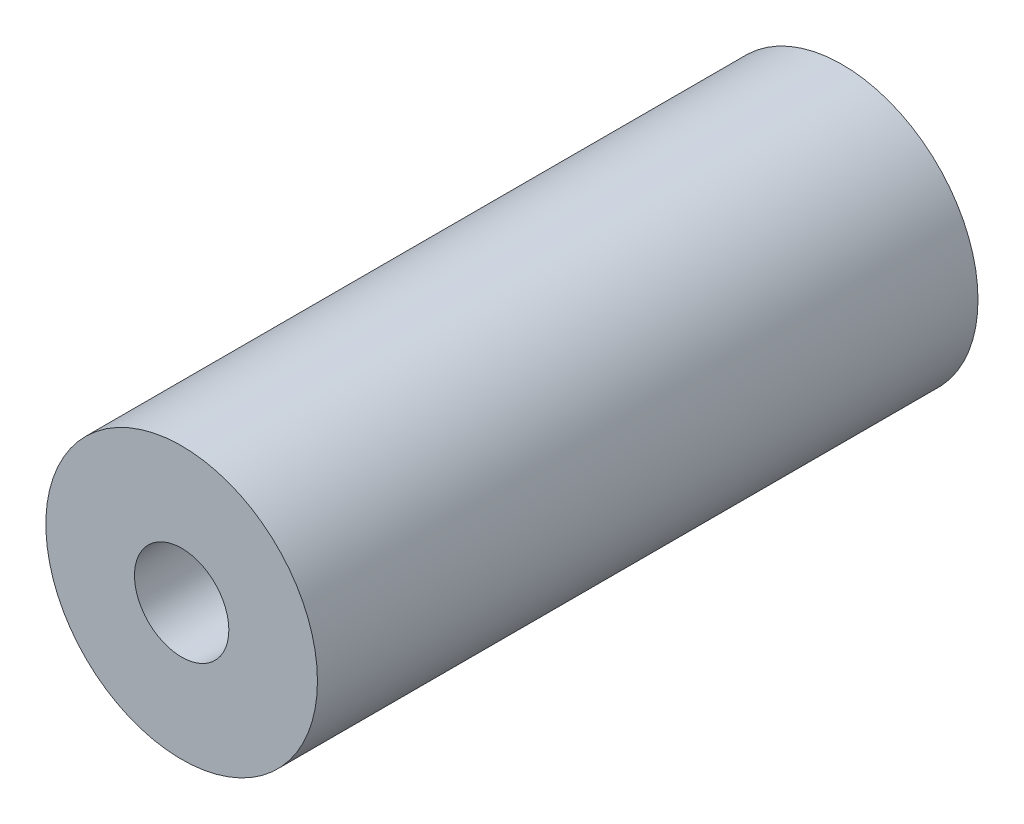
ISO-10303-21;
HEADER;
FILE_DESCRIPTION(('STEP AP214'),'2;1');
FILE_NAME('part.step','',(''),(''),'','','');
FILE_SCHEMA(('AUTOMOTIVE_DESIGN { 1 0 10303 214 1 1 1 1 }'));
ENDSEC;
DATA;
#1=APPLICATION_CONTEXT('core data for automotive mechanical design processes');
#2=APPLICATION_PROTOCOL_DEFINITION('international standard','automotive_design',2000,#1);
#3=PRODUCT_CONTEXT('',#1,'mechanical');
#4=PRODUCT('Part','Part','',(#3));
#5=PRODUCT_RELATED_PRODUCT_CATEGORY('part','',(#4));
#6=PRODUCT_DEFINITION_FORMATION('','',#4);
#7=PRODUCT_DEFINITION_CONTEXT('part definition',#1,'design');
#8=PRODUCT_DEFINITION('design','',#6,#7);
#9=PRODUCT_DEFINITION_SHAPE('','',#8);
#10=(LENGTH_UNIT() NAMED_UNIT(*) SI_UNIT(.MILLI.,.METRE.));
#11=(NAMED_UNIT(*) PLANE_ANGLE_UNIT() SI_UNIT($,.RADIAN.));
#12=(NAMED_UNIT(*) SI_UNIT($,.STERADIAN.) SOLID_ANGLE_UNIT());
#13=UNCERTAINTY_MEASURE_WITH_UNIT(LENGTH_MEASURE(1.E-05),#10,'distance_accuracy_value','');
#14=(GEOMETRIC_REPRESENTATION_CONTEXT(3) GLOBAL_UNCERTAINTY_ASSIGNED_CONTEXT((#13)) GLOBAL_UNIT_ASSIGNED_CONTEXT((#10,
#11,#12)) REPRESENTATION_CONTEXT('',''));
#15=CARTESIAN_POINT('',(0.,0.,0.));
#16=DIRECTION('',(0.,0.,1.));
#17=DIRECTION('',(1.,0.,0.));
#18=AXIS2_PLACEMENT_3D('',#15,#16,#17);
#19=CARTESIAN_POINT('',(0.,0.,-66.4234682221834));
#20=DIRECTION('',(0.,0.,1.));
#21=DIRECTION('',(1.,0.,0.));
#22=AXIS2_PLACEMENT_3D('',#19,#20,#21);
#23=CYLINDRICAL_SURFACE('',#22,8.635);
#24=CARTESIAN_POINT('',(0.,0.,-42.));
#25=DIRECTION('',(0.,0.,1.));
#26=DIRECTION('',(1.,0.,0.));
#27=AXIS2_PLACEMENT_3D('',#24,#25,#26);
#28=CIRCLE('',#27,8.635);
#29=CARTESIAN_POINT('',(8.635,0.,-42.));
#30=VERTEX_POINT('',#29);
#31=EDGE_CURVE('E10',#30,#30,#28,.F.);
#32=ORIENTED_EDGE('',*,*,#31,.F.);
#33=EDGE_LOOP('',(#32));
#34=FACE_BOUND('',#33,.T.);
#35=CARTESIAN_POINT('',(0.,0.,0.));
#36=DIRECTION('',(0.,0.,1.));
#37=DIRECTION('',(1.,0.,0.));
#38=AXIS2_PLACEMENT_3D('',#35,#36,#37);
#39=CIRCLE('',#38,8.635);
#40=CARTESIAN_POINT('',(8.635,0.,0.));
#41=VERTEX_POINT('',#40);
#42=EDGE_CURVE('E36',#41,#41,#39,.T.);
#43=ORIENTED_EDGE('',*,*,#42,.F.);
#44=EDGE_LOOP('',(#43));
#45=FACE_BOUND('',#44,.T.);
#46=ADVANCED_FACE('F30',(#34,#45),#23,.T.);
#47=CARTESIAN_POINT('',(0.,0.,0.));
#48=DIRECTION('',(0.,0.,1.));
#49=DIRECTION('',(1.,0.,0.));
#50=AXIS2_PLACEMENT_3D('',#47,#48,#49);
#51=PLANE('',#50);
#52=CARTESIAN_POINT('',(0.,0.,0.));
#53=DIRECTION('',(0.,0.,1.));
#54=DIRECTION('',(1.,0.,0.));
#55=AXIS2_PLACEMENT_3D('',#52,#53,#54);
#56=CIRCLE('',#55,3.);
#57=CARTESIAN_POINT('',(3.,0.,0.));
#58=VERTEX_POINT('',#57);
#59=EDGE_CURVE('E44',#58,#58,#56,.T.);
#60=ORIENTED_EDGE('',*,*,#59,.F.);
#61=EDGE_LOOP('',(#60));
#62=FACE_BOUND('',#61,.T.);
#63=ORIENTED_EDGE('',*,*,#42,.T.);
#64=EDGE_LOOP('',(#63));
#65=FACE_BOUND('',#64,.T.);
#66=ADVANCED_FACE('F52',(#62,#65),#51,.T.);
#67=CARTESIAN_POINT('',(0.,0.,-42.));
#68=DIRECTION('',(0.,0.,1.));
#69=DIRECTION('',(1.,0.,0.));
#70=AXIS2_PLACEMENT_3D('',#67,#68,#69);
#71=PLANE('',#70);
#72=CARTESIAN_POINT('',(0.,0.,-42.));
#73=DIRECTION('',(0.,0.,1.));
#74=DIRECTION('',(1.,0.,0.));
#75=AXIS2_PLACEMENT_3D('',#72,#73,#74);
#76=CIRCLE('',#75,3.);
#77=CARTESIAN_POINT('',(3.,0.,-42.));
#78=VERTEX_POINT('',#77);
#79=EDGE_CURVE('E40',#78,#78,#76,.F.);
#80=ORIENTED_EDGE('',*,*,#79,.F.);
#81=EDGE_LOOP('',(#80));
#82=FACE_BOUND('',#81,.T.);
#83=ORIENTED_EDGE('',*,*,#31,.T.);
#84=EDGE_LOOP('',(#83));
#85=FACE_BOUND('',#84,.T.);
#86=ADVANCED_FACE('F54',(#82,#85),#71,.F.);
#87=CARTESIAN_POINT('',(0.,0.,-50.4852813742386));
#88=DIRECTION('',(0.,0.,1.));
#89=DIRECTION('',(1.,0.,0.));
#90=AXIS2_PLACEMENT_3D('',#87,#88,#89);
#91=CYLINDRICAL_SURFACE('',#90,3.);
#92=ORIENTED_EDGE('',*,*,#79,.T.);
#93=EDGE_LOOP('',(#92));
#94=FACE_BOUND('',#93,.T.);
#95=ORIENTED_EDGE('',*,*,#59,.T.);
#96=EDGE_LOOP('',(#95));
#97=FACE_BOUND('',#96,.T.);
#98=ADVANCED_FACE('F50',(#94,#97),#91,.F.);
#99=CLOSED_SHELL('',(#46,#66,#86,#98));
#100=MANIFOLD_SOLID_BREP('B2',#99);
#101=ADVANCED_BREP_SHAPE_REPRESENTATION('',(#18,#100),#14);
#102=SHAPE_DEFINITION_REPRESENTATION(#9,#101);
ENDSEC;
END-ISO-10303-21;
